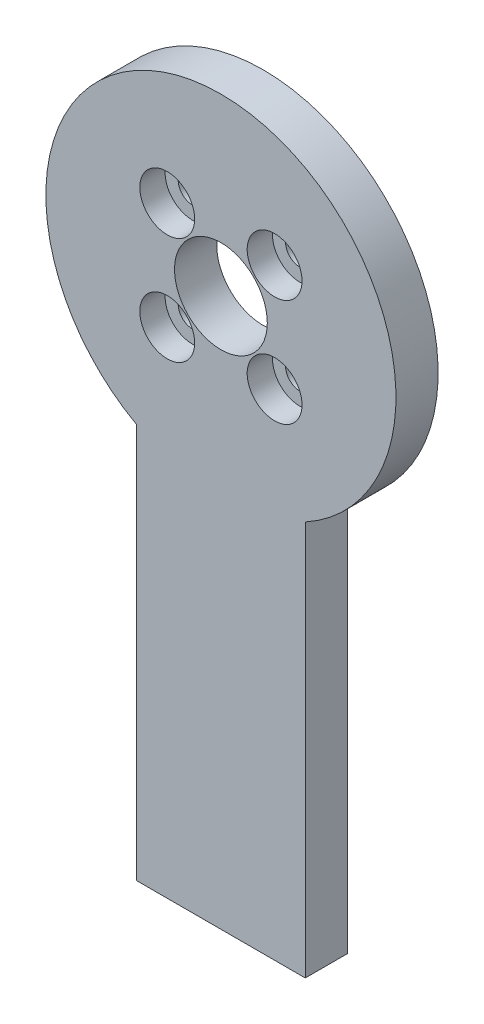
ISO-10303-21;
HEADER;
FILE_DESCRIPTION(('STEP AP214'),'2;1');
FILE_NAME('part.step','',(''),(''),'','','');
FILE_SCHEMA(('AUTOMOTIVE_DESIGN { 1 0 10303 214 1 1 1 1 }'));
ENDSEC;
DATA;
#1=APPLICATION_CONTEXT('core data for automotive mechanical design processes');
#2=APPLICATION_PROTOCOL_DEFINITION('international standard','automotive_design',2000,#1);
#3=PRODUCT_CONTEXT('',#1,'mechanical');
#4=PRODUCT('Part','Part','',(#3));
#5=PRODUCT_RELATED_PRODUCT_CATEGORY('part','',(#4));
#6=PRODUCT_DEFINITION_FORMATION('','',#4);
#7=PRODUCT_DEFINITION_CONTEXT('part definition',#1,'design');
#8=PRODUCT_DEFINITION('design','',#6,#7);
#9=PRODUCT_DEFINITION_SHAPE('','',#8);
#10=(LENGTH_UNIT() NAMED_UNIT(*) SI_UNIT(.MILLI.,.METRE.));
#11=(NAMED_UNIT(*) PLANE_ANGLE_UNIT() SI_UNIT($,.RADIAN.));
#12=(NAMED_UNIT(*) SI_UNIT($,.STERADIAN.) SOLID_ANGLE_UNIT());
#13=UNCERTAINTY_MEASURE_WITH_UNIT(LENGTH_MEASURE(1.E-05),#10,'distance_accuracy_value','');
#14=(GEOMETRIC_REPRESENTATION_CONTEXT(3) GLOBAL_UNCERTAINTY_ASSIGNED_CONTEXT((#13)) GLOBAL_UNIT_ASSIGNED_CONTEXT((#10,
#11,#12)) REPRESENTATION_CONTEXT('',''));
#15=CARTESIAN_POINT('',(0.,0.,0.));
#16=DIRECTION('',(0.,0.,1.));
#17=DIRECTION('',(1.,0.,0.));
#18=AXIS2_PLACEMENT_3D('',#15,#16,#17);
#19=CARTESIAN_POINT('',(0.,0.,5.));
#20=DIRECTION('',(0.,0.,-1.));
#21=DIRECTION('',(-1.,0.,0.));
#22=AXIS2_PLACEMENT_3D('',#19,#20,#21);
#23=CYLINDRICAL_SURFACE('',#22,20.75);
#24=CARTESIAN_POINT('',(0.,0.,5.));
#25=DIRECTION('',(0.,0.,1.));
#26=DIRECTION('',(1.,0.,0.));
#27=AXIS2_PLACEMENT_3D('',#24,#25,#26);
#28=CIRCLE('',#27,20.75);
#29=CARTESIAN_POINT('',(10.,-18.1813778355767,5.));
#30=VERTEX_POINT('',#29);
#31=CARTESIAN_POINT('',(-9.99999999999999,-18.1813778355767,5.));
#32=VERTEX_POINT('',#31);
#33=EDGE_CURVE('E11',#30,#32,#28,.T.);
#34=ORIENTED_EDGE('',*,*,#33,.F.);
#35=DIRECTION('',(0.,0.,-1.));
#36=VECTOR('',#35,1.);
#37=CARTESIAN_POINT('',(10.,-18.1813778355767,5.));
#38=LINE('',#37,#36);
#39=CARTESIAN_POINT('',(10.,-18.1813778355767,0.));
#40=VERTEX_POINT('',#39);
#41=EDGE_CURVE('E100',#30,#40,#38,.T.);
#42=ORIENTED_EDGE('',*,*,#41,.T.);
#43=CARTESIAN_POINT('',(0.,0.,0.));
#44=DIRECTION('',(0.,0.,1.));
#45=DIRECTION('',(1.,0.,0.));
#46=AXIS2_PLACEMENT_3D('',#43,#44,#45);
#47=CIRCLE('',#46,20.75);
#48=CARTESIAN_POINT('',(-9.99999999999999,-18.1813778355767,0.));
#49=VERTEX_POINT('',#48);
#50=EDGE_CURVE('E38',#40,#49,#47,.T.);
#51=ORIENTED_EDGE('',*,*,#50,.T.);
#52=DIRECTION('',(0.,0.,-1.));
#53=VECTOR('',#52,1.);
#54=CARTESIAN_POINT('',(-9.99999999999999,-18.1813778355767,5.));
#55=LINE('',#54,#53);
#56=EDGE_CURVE('E52',#49,#32,#55,.F.);
#57=ORIENTED_EDGE('',*,*,#56,.T.);
#58=EDGE_LOOP('',(#34,#42,#51,#57));
#59=FACE_BOUND('',#58,.T.);
#60=ADVANCED_FACE('F35',(#59),#23,.T.);
#61=CARTESIAN_POINT('',(0.,0.,5.));
#62=DIRECTION('',(0.,0.,1.));
#63=DIRECTION('',(1.,0.,0.));
#64=AXIS2_PLACEMENT_3D('',#61,#62,#63);
#65=PLANE('',#64);
#66=ORIENTED_EDGE('',*,*,#33,.T.);
#67=DIRECTION('',(0.,-1.,0.));
#68=VECTOR('',#67,1.);
#69=CARTESIAN_POINT('',(-9.99999999999999,-15.,5.));
#70=LINE('',#69,#68);
#71=CARTESIAN_POINT('',(-9.99999999999999,-65.,5.));
#72=VERTEX_POINT('',#71);
#73=EDGE_CURVE('E72',#32,#72,#70,.T.);
#74=ORIENTED_EDGE('',*,*,#73,.T.);
#75=DIRECTION('',(1.,0.,0.));
#76=VECTOR('',#75,1.);
#77=CARTESIAN_POINT('',(-9.99999999999999,-65.,5.));
#78=LINE('',#77,#76);
#79=CARTESIAN_POINT('',(10.,-65.,5.));
#80=VERTEX_POINT('',#79);
#81=EDGE_CURVE('E78',#72,#80,#78,.T.);
#82=ORIENTED_EDGE('',*,*,#81,.T.);
#83=DIRECTION('',(0.,1.,0.));
#84=VECTOR('',#83,1.);
#85=CARTESIAN_POINT('',(10.,-15.,5.));
#86=LINE('',#85,#84);
#87=EDGE_CURVE('E80',#80,#30,#86,.T.);
#88=ORIENTED_EDGE('',*,*,#87,.T.);
#89=EDGE_LOOP('',(#66,#74,#82,#88));
#90=FACE_BOUND('',#89,.T.);
#91=CARTESIAN_POINT('',(0.,0.,5.));
#92=DIRECTION('',(0.,0.,1.));
#93=DIRECTION('',(1.,0.,0.));
#94=AXIS2_PLACEMENT_3D('',#91,#92,#93);
#95=CIRCLE('',#94,5.5);
#96=CARTESIAN_POINT('',(5.5,0.,5.));
#97=VERTEX_POINT('',#96);
#98=EDGE_CURVE('E103',#97,#97,#95,.T.);
#99=ORIENTED_EDGE('',*,*,#98,.F.);
#100=EDGE_LOOP('',(#99));
#101=FACE_BOUND('',#100,.T.);
#102=CARTESIAN_POINT('',(-6.36396103067894,6.36396103067891,5.));
#103=DIRECTION('',(0.,0.,1.));
#104=DIRECTION('',(1.,0.,0.));
#105=AXIS2_PLACEMENT_3D('',#102,#103,#104);
#106=CIRCLE('',#105,3.25);
#107=CARTESIAN_POINT('',(-3.11396103067894,6.36396103067891,5.));
#108=VERTEX_POINT('',#107);
#109=EDGE_CURVE('E107',#108,#108,#106,.T.);
#110=ORIENTED_EDGE('',*,*,#109,.F.);
#111=EDGE_LOOP('',(#110));
#112=FACE_BOUND('',#111,.T.);
#113=CARTESIAN_POINT('',(6.36396103067891,6.36396103067895,5.));
#114=DIRECTION('',(0.,0.,1.));
#115=DIRECTION('',(1.,0.,0.));
#116=AXIS2_PLACEMENT_3D('',#113,#114,#115);
#117=CIRCLE('',#116,3.25);
#118=CARTESIAN_POINT('',(9.61396103067891,6.36396103067895,5.));
#119=VERTEX_POINT('',#118);
#120=EDGE_CURVE('E121',#119,#119,#117,.T.);
#121=ORIENTED_EDGE('',*,*,#120,.F.);
#122=EDGE_LOOP('',(#121));
#123=FACE_BOUND('',#122,.T.);
#124=CARTESIAN_POINT('',(6.36396103067894,-6.36396103067892,5.));
#125=DIRECTION('',(0.,0.,1.));
#126=DIRECTION('',(1.,0.,0.));
#127=AXIS2_PLACEMENT_3D('',#124,#125,#126);
#128=CIRCLE('',#127,3.25);
#129=CARTESIAN_POINT('',(9.61396103067894,-6.36396103067892,5.));
#130=VERTEX_POINT('',#129);
#131=EDGE_CURVE('E133',#130,#130,#128,.T.);
#132=ORIENTED_EDGE('',*,*,#131,.F.);
#133=EDGE_LOOP('',(#132));
#134=FACE_BOUND('',#133,.T.);
#135=CARTESIAN_POINT('',(-6.36396103067892,-6.36396103067894,5.));
#136=DIRECTION('',(0.,0.,1.));
#137=DIRECTION('',(1.,0.,0.));
#138=AXIS2_PLACEMENT_3D('',#135,#136,#137);
#139=CIRCLE('',#138,3.25);
#140=CARTESIAN_POINT('',(-3.11396103067892,-6.36396103067894,5.));
#141=VERTEX_POINT('',#140);
#142=EDGE_CURVE('E145',#141,#141,#139,.T.);
#143=ORIENTED_EDGE('',*,*,#142,.F.);
#144=EDGE_LOOP('',(#143));
#145=FACE_BOUND('',#144,.T.);
#146=ADVANCED_FACE('F74',(#90,#101,#112,#123,#134,#145),#65,.T.);
#147=CARTESIAN_POINT('',(0.,0.,0.));
#148=DIRECTION('',(0.,0.,1.));
#149=DIRECTION('',(1.,0.,0.));
#150=AXIS2_PLACEMENT_3D('',#147,#148,#149);
#151=PLANE('',#150);
#152=ORIENTED_EDGE('',*,*,#50,.F.);
#153=DIRECTION('',(0.,-1.,0.));
#154=VECTOR('',#153,1.);
#155=CARTESIAN_POINT('',(10.,-15.,0.));
#156=LINE('',#155,#154);
#157=CARTESIAN_POINT('',(10.,-65.,0.));
#158=VERTEX_POINT('',#157);
#159=EDGE_CURVE('E101',#40,#158,#156,.T.);
#160=ORIENTED_EDGE('',*,*,#159,.T.);
#161=DIRECTION('',(-1.,0.,0.));
#162=VECTOR('',#161,1.);
#163=CARTESIAN_POINT('',(-9.99999999999999,-65.,0.));
#164=LINE('',#163,#162);
#165=CARTESIAN_POINT('',(-9.99999999999999,-65.,0.));
#166=VERTEX_POINT('',#165);
#167=EDGE_CURVE('E162',#158,#166,#164,.T.);
#168=ORIENTED_EDGE('',*,*,#167,.T.);
#169=DIRECTION('',(0.,1.,0.));
#170=VECTOR('',#169,1.);
#171=CARTESIAN_POINT('',(-9.99999999999999,-15.,0.));
#172=LINE('',#171,#170);
#173=EDGE_CURVE('E87',#166,#49,#172,.T.);
#174=ORIENTED_EDGE('',*,*,#173,.T.);
#175=EDGE_LOOP('',(#152,#160,#168,#174));
#176=FACE_BOUND('',#175,.T.);
#177=CARTESIAN_POINT('',(0.,0.,0.));
#178=DIRECTION('',(0.,0.,1.));
#179=DIRECTION('',(1.,0.,0.));
#180=AXIS2_PLACEMENT_3D('',#177,#178,#179);
#181=CIRCLE('',#180,5.5);
#182=CARTESIAN_POINT('',(5.5,0.,0.));
#183=VERTEX_POINT('',#182);
#184=EDGE_CURVE('E104',#183,#183,#181,.T.);
#185=ORIENTED_EDGE('',*,*,#184,.T.);
#186=EDGE_LOOP('',(#185));
#187=FACE_BOUND('',#186,.T.);
#188=CARTESIAN_POINT('',(-6.36396103067894,6.36396103067891,0.));
#189=DIRECTION('',(0.,0.,1.));
#190=DIRECTION('',(1.,0.,0.));
#191=AXIS2_PLACEMENT_3D('',#188,#189,#190);
#192=CIRCLE('',#191,1.7);
#193=CARTESIAN_POINT('',(-4.66396103067894,6.36396103067891,0.));
#194=VERTEX_POINT('',#193);
#195=EDGE_CURVE('E118',#194,#194,#192,.T.);
#196=ORIENTED_EDGE('',*,*,#195,.T.);
#197=EDGE_LOOP('',(#196));
#198=FACE_BOUND('',#197,.T.);
#199=CARTESIAN_POINT('',(6.36396103067891,6.36396103067895,0.));
#200=DIRECTION('',(0.,0.,1.));
#201=DIRECTION('',(1.,0.,0.));
#202=AXIS2_PLACEMENT_3D('',#199,#200,#201);
#203=CIRCLE('',#202,1.7);
#204=CARTESIAN_POINT('',(8.06396103067891,6.36396103067895,0.));
#205=VERTEX_POINT('',#204);
#206=EDGE_CURVE('E130',#205,#205,#203,.T.);
#207=ORIENTED_EDGE('',*,*,#206,.T.);
#208=EDGE_LOOP('',(#207));
#209=FACE_BOUND('',#208,.T.);
#210=CARTESIAN_POINT('',(6.36396103067894,-6.36396103067892,0.));
#211=DIRECTION('',(0.,0.,1.));
#212=DIRECTION('',(1.,0.,0.));
#213=AXIS2_PLACEMENT_3D('',#210,#211,#212);
#214=CIRCLE('',#213,1.7);
#215=CARTESIAN_POINT('',(8.06396103067894,-6.36396103067892,0.));
#216=VERTEX_POINT('',#215);
#217=EDGE_CURVE('E142',#216,#216,#214,.T.);
#218=ORIENTED_EDGE('',*,*,#217,.T.);
#219=EDGE_LOOP('',(#218));
#220=FACE_BOUND('',#219,.T.);
#221=CARTESIAN_POINT('',(-6.36396103067892,-6.36396103067894,0.));
#222=DIRECTION('',(0.,0.,1.));
#223=DIRECTION('',(1.,0.,0.));
#224=AXIS2_PLACEMENT_3D('',#221,#222,#223);
#225=CIRCLE('',#224,1.7);
#226=CARTESIAN_POINT('',(-4.66396103067892,-6.36396103067894,0.));
#227=VERTEX_POINT('',#226);
#228=EDGE_CURVE('E154',#227,#227,#225,.T.);
#229=ORIENTED_EDGE('',*,*,#228,.T.);
#230=EDGE_LOOP('',(#229));
#231=FACE_BOUND('',#230,.T.);
#232=ADVANCED_FACE('F160',(#176,#187,#198,#209,#220,#231),#151,.F.);
#233=CARTESIAN_POINT('',(-6.36396103067892,-6.36396103067894,5.));
#234=DIRECTION('',(0.,0.,1.));
#235=DIRECTION('',(1.,0.,0.));
#236=AXIS2_PLACEMENT_3D('',#233,#234,#235);
#237=CYLINDRICAL_SURFACE('',#236,1.7);
#238=ORIENTED_EDGE('',*,*,#228,.F.);
#239=EDGE_LOOP('',(#238));
#240=FACE_BOUND('',#239,.T.);
#241=CARTESIAN_POINT('',(-6.36396103067892,-6.36396103067894,2.));
#242=DIRECTION('',(0.,0.,1.));
#243=DIRECTION('',(1.,0.,0.));
#244=AXIS2_PLACEMENT_3D('',#241,#242,#243);
#245=CIRCLE('',#244,1.7);
#246=CARTESIAN_POINT('',(-4.66396103067892,-6.36396103067894,2.));
#247=VERTEX_POINT('',#246);
#248=EDGE_CURVE('E151',#247,#247,#245,.T.);
#249=ORIENTED_EDGE('',*,*,#248,.T.);
#250=EDGE_LOOP('',(#249));
#251=FACE_BOUND('',#250,.T.);
#252=ADVANCED_FACE('F187',(#240,#251),#237,.F.);
#253=CARTESIAN_POINT('',(-4.66396103067892,-6.36396103067894,2.));
#254=DIRECTION('',(0.,0.,-1.));
#255=DIRECTION('',(-1.,0.,0.));
#256=AXIS2_PLACEMENT_3D('',#253,#254,#255);
#257=PLANE('',#256);
#258=ORIENTED_EDGE('',*,*,#248,.F.);
#259=EDGE_LOOP('',(#258));
#260=FACE_BOUND('',#259,.T.);
#261=CARTESIAN_POINT('',(-6.36396103067892,-6.36396103067894,2.));
#262=DIRECTION('',(0.,0.,1.));
#263=DIRECTION('',(1.,0.,0.));
#264=AXIS2_PLACEMENT_3D('',#261,#262,#263);
#265=CIRCLE('',#264,3.25);
#266=CARTESIAN_POINT('',(-3.11396103067892,-6.36396103067894,2.));
#267=VERTEX_POINT('',#266);
#268=EDGE_CURVE('E148',#267,#267,#265,.T.);
#269=ORIENTED_EDGE('',*,*,#268,.T.);
#270=EDGE_LOOP('',(#269));
#271=FACE_BOUND('',#270,.T.);
#272=ADVANCED_FACE('F191',(#260,#271),#257,.F.);
#273=CARTESIAN_POINT('',(-6.36396103067892,-6.36396103067894,5.));
#274=DIRECTION('',(0.,0.,1.));
#275=DIRECTION('',(1.,0.,0.));
#276=AXIS2_PLACEMENT_3D('',#273,#274,#275);
#277=CYLINDRICAL_SURFACE('',#276,3.25);
#278=ORIENTED_EDGE('',*,*,#268,.F.);
#279=EDGE_LOOP('',(#278));
#280=FACE_BOUND('',#279,.T.);
#281=ORIENTED_EDGE('',*,*,#142,.T.);
#282=EDGE_LOOP('',(#281));
#283=FACE_BOUND('',#282,.T.);
#284=ADVANCED_FACE('F195',(#280,#283),#277,.F.);
#285=CARTESIAN_POINT('',(6.36396103067894,-6.36396103067892,5.));
#286=DIRECTION('',(0.,0.,1.));
#287=DIRECTION('',(1.,0.,0.));
#288=AXIS2_PLACEMENT_3D('',#285,#286,#287);
#289=CYLINDRICAL_SURFACE('',#288,1.7);
#290=ORIENTED_EDGE('',*,*,#217,.F.);
#291=EDGE_LOOP('',(#290));
#292=FACE_BOUND('',#291,.T.);
#293=CARTESIAN_POINT('',(6.36396103067894,-6.36396103067892,2.));
#294=DIRECTION('',(0.,0.,1.));
#295=DIRECTION('',(1.,0.,0.));
#296=AXIS2_PLACEMENT_3D('',#293,#294,#295);
#297=CIRCLE('',#296,1.7);
#298=CARTESIAN_POINT('',(8.06396103067894,-6.36396103067892,2.));
#299=VERTEX_POINT('',#298);
#300=EDGE_CURVE('E139',#299,#299,#297,.T.);
#301=ORIENTED_EDGE('',*,*,#300,.T.);
#302=EDGE_LOOP('',(#301));
#303=FACE_BOUND('',#302,.T.);
#304=ADVANCED_FACE('F199',(#292,#303),#289,.F.);
#305=CARTESIAN_POINT('',(8.06396103067894,-6.36396103067892,2.));
#306=DIRECTION('',(0.,0.,-1.));
#307=DIRECTION('',(-1.,0.,0.));
#308=AXIS2_PLACEMENT_3D('',#305,#306,#307);
#309=PLANE('',#308);
#310=ORIENTED_EDGE('',*,*,#300,.F.);
#311=EDGE_LOOP('',(#310));
#312=FACE_BOUND('',#311,.T.);
#313=CARTESIAN_POINT('',(6.36396103067894,-6.36396103067892,2.));
#314=DIRECTION('',(0.,0.,1.));
#315=DIRECTION('',(1.,0.,0.));
#316=AXIS2_PLACEMENT_3D('',#313,#314,#315);
#317=CIRCLE('',#316,3.25);
#318=CARTESIAN_POINT('',(9.61396103067894,-6.36396103067892,2.));
#319=VERTEX_POINT('',#318);
#320=EDGE_CURVE('E136',#319,#319,#317,.T.);
#321=ORIENTED_EDGE('',*,*,#320,.T.);
#322=EDGE_LOOP('',(#321));
#323=FACE_BOUND('',#322,.T.);
#324=ADVANCED_FACE('F203',(#312,#323),#309,.F.);
#325=CARTESIAN_POINT('',(6.36396103067894,-6.36396103067892,5.));
#326=DIRECTION('',(0.,0.,1.));
#327=DIRECTION('',(1.,0.,0.));
#328=AXIS2_PLACEMENT_3D('',#325,#326,#327);
#329=CYLINDRICAL_SURFACE('',#328,3.25);
#330=ORIENTED_EDGE('',*,*,#320,.F.);
#331=EDGE_LOOP('',(#330));
#332=FACE_BOUND('',#331,.T.);
#333=ORIENTED_EDGE('',*,*,#131,.T.);
#334=EDGE_LOOP('',(#333));
#335=FACE_BOUND('',#334,.T.);
#336=ADVANCED_FACE('F207',(#332,#335),#329,.F.);
#337=CARTESIAN_POINT('',(6.36396103067891,6.36396103067895,5.));
#338=DIRECTION('',(0.,0.,1.));
#339=DIRECTION('',(1.,0.,0.));
#340=AXIS2_PLACEMENT_3D('',#337,#338,#339);
#341=CYLINDRICAL_SURFACE('',#340,1.7);
#342=ORIENTED_EDGE('',*,*,#206,.F.);
#343=EDGE_LOOP('',(#342));
#344=FACE_BOUND('',#343,.T.);
#345=CARTESIAN_POINT('',(6.36396103067891,6.36396103067895,2.));
#346=DIRECTION('',(0.,0.,1.));
#347=DIRECTION('',(1.,0.,0.));
#348=AXIS2_PLACEMENT_3D('',#345,#346,#347);
#349=CIRCLE('',#348,1.7);
#350=CARTESIAN_POINT('',(8.06396103067891,6.36396103067895,2.));
#351=VERTEX_POINT('',#350);
#352=EDGE_CURVE('E127',#351,#351,#349,.T.);
#353=ORIENTED_EDGE('',*,*,#352,.T.);
#354=EDGE_LOOP('',(#353));
#355=FACE_BOUND('',#354,.T.);
#356=ADVANCED_FACE('F211',(#344,#355),#341,.F.);
#357=CARTESIAN_POINT('',(8.06396103067891,6.36396103067895,2.));
#358=DIRECTION('',(0.,0.,-1.));
#359=DIRECTION('',(-1.,0.,0.));
#360=AXIS2_PLACEMENT_3D('',#357,#358,#359);
#361=PLANE('',#360);
#362=ORIENTED_EDGE('',*,*,#352,.F.);
#363=EDGE_LOOP('',(#362));
#364=FACE_BOUND('',#363,.T.);
#365=CARTESIAN_POINT('',(6.36396103067891,6.36396103067895,2.));
#366=DIRECTION('',(0.,0.,1.));
#367=DIRECTION('',(1.,0.,0.));
#368=AXIS2_PLACEMENT_3D('',#365,#366,#367);
#369=CIRCLE('',#368,3.25);
#370=CARTESIAN_POINT('',(9.61396103067891,6.36396103067895,2.));
#371=VERTEX_POINT('',#370);
#372=EDGE_CURVE('E124',#371,#371,#369,.T.);
#373=ORIENTED_EDGE('',*,*,#372,.T.);
#374=EDGE_LOOP('',(#373));
#375=FACE_BOUND('',#374,.T.);
#376=ADVANCED_FACE('F215',(#364,#375),#361,.F.);
#377=CARTESIAN_POINT('',(6.36396103067891,6.36396103067895,5.));
#378=DIRECTION('',(0.,0.,1.));
#379=DIRECTION('',(1.,0.,0.));
#380=AXIS2_PLACEMENT_3D('',#377,#378,#379);
#381=CYLINDRICAL_SURFACE('',#380,3.25);
#382=ORIENTED_EDGE('',*,*,#372,.F.);
#383=EDGE_LOOP('',(#382));
#384=FACE_BOUND('',#383,.T.);
#385=ORIENTED_EDGE('',*,*,#120,.T.);
#386=EDGE_LOOP('',(#385));
#387=FACE_BOUND('',#386,.T.);
#388=ADVANCED_FACE('F219',(#384,#387),#381,.F.);
#389=CARTESIAN_POINT('',(-6.36396103067894,6.36396103067891,5.));
#390=DIRECTION('',(0.,0.,1.));
#391=DIRECTION('',(1.,0.,0.));
#392=AXIS2_PLACEMENT_3D('',#389,#390,#391);
#393=CYLINDRICAL_SURFACE('',#392,1.7);
#394=ORIENTED_EDGE('',*,*,#195,.F.);
#395=EDGE_LOOP('',(#394));
#396=FACE_BOUND('',#395,.T.);
#397=CARTESIAN_POINT('',(-6.36396103067894,6.36396103067891,2.));
#398=DIRECTION('',(0.,0.,1.));
#399=DIRECTION('',(1.,0.,0.));
#400=AXIS2_PLACEMENT_3D('',#397,#398,#399);
#401=CIRCLE('',#400,1.7);
#402=CARTESIAN_POINT('',(-4.66396103067894,6.36396103067891,2.));
#403=VERTEX_POINT('',#402);
#404=EDGE_CURVE('E115',#403,#403,#401,.T.);
#405=ORIENTED_EDGE('',*,*,#404,.T.);
#406=EDGE_LOOP('',(#405));
#407=FACE_BOUND('',#406,.T.);
#408=ADVANCED_FACE('F223',(#396,#407),#393,.F.);
#409=CARTESIAN_POINT('',(-4.66396103067894,6.36396103067891,2.));
#410=DIRECTION('',(0.,0.,-1.));
#411=DIRECTION('',(-1.,0.,0.));
#412=AXIS2_PLACEMENT_3D('',#409,#410,#411);
#413=PLANE('',#412);
#414=ORIENTED_EDGE('',*,*,#404,.F.);
#415=EDGE_LOOP('',(#414));
#416=FACE_BOUND('',#415,.T.);
#417=CARTESIAN_POINT('',(-6.36396103067894,6.36396103067891,2.));
#418=DIRECTION('',(0.,0.,1.));
#419=DIRECTION('',(1.,0.,0.));
#420=AXIS2_PLACEMENT_3D('',#417,#418,#419);
#421=CIRCLE('',#420,3.25);
#422=CARTESIAN_POINT('',(-3.11396103067894,6.36396103067891,2.));
#423=VERTEX_POINT('',#422);
#424=EDGE_CURVE('E112',#423,#423,#421,.T.);
#425=ORIENTED_EDGE('',*,*,#424,.T.);
#426=EDGE_LOOP('',(#425));
#427=FACE_BOUND('',#426,.T.);
#428=ADVANCED_FACE('F227',(#416,#427),#413,.F.);
#429=CARTESIAN_POINT('',(-6.36396103067894,6.36396103067891,5.));
#430=DIRECTION('',(0.,0.,1.));
#431=DIRECTION('',(1.,0.,0.));
#432=AXIS2_PLACEMENT_3D('',#429,#430,#431);
#433=CYLINDRICAL_SURFACE('',#432,3.25);
#434=ORIENTED_EDGE('',*,*,#424,.F.);
#435=EDGE_LOOP('',(#434));
#436=FACE_BOUND('',#435,.T.);
#437=ORIENTED_EDGE('',*,*,#109,.T.);
#438=EDGE_LOOP('',(#437));
#439=FACE_BOUND('',#438,.T.);
#440=ADVANCED_FACE('F176',(#436,#439),#433,.F.);
#441=CARTESIAN_POINT('',(0.,0.,0.));
#442=DIRECTION('',(0.,0.,1.));
#443=DIRECTION('',(1.,0.,0.));
#444=AXIS2_PLACEMENT_3D('',#441,#442,#443);
#445=CYLINDRICAL_SURFACE('',#444,5.5);
#446=ORIENTED_EDGE('',*,*,#184,.F.);
#447=EDGE_LOOP('',(#446));
#448=FACE_BOUND('',#447,.T.);
#449=ORIENTED_EDGE('',*,*,#98,.T.);
#450=EDGE_LOOP('',(#449));
#451=FACE_BOUND('',#450,.T.);
#452=ADVANCED_FACE('F169',(#448,#451),#445,.F.);
#453=CARTESIAN_POINT('',(10.,-15.,-53.8516480713451));
#454=DIRECTION('',(1.,0.,0.));
#455=DIRECTION('',(0.,0.,-1.));
#456=AXIS2_PLACEMENT_3D('',#453,#454,#455);
#457=PLANE('',#456);
#458=ORIENTED_EDGE('',*,*,#41,.F.);
#459=ORIENTED_EDGE('',*,*,#87,.F.);
#460=DIRECTION('',(0.,0.,1.));
#461=VECTOR('',#460,1.);
#462=CARTESIAN_POINT('',(10.,-65.,-53.8516480713451));
#463=LINE('',#462,#461);
#464=EDGE_CURVE('E90',#158,#80,#463,.T.);
#465=ORIENTED_EDGE('',*,*,#464,.F.);
#466=ORIENTED_EDGE('',*,*,#159,.F.);
#467=EDGE_LOOP('',(#458,#459,#465,#466));
#468=FACE_BOUND('',#467,.T.);
#469=ADVANCED_FACE('F167',(#468),#457,.T.);
#470=CARTESIAN_POINT('',(-9.99999999999999,-15.,-53.8516480713451));
#471=DIRECTION('',(-1.,0.,0.));
#472=DIRECTION('',(0.,0.,1.));
#473=AXIS2_PLACEMENT_3D('',#470,#471,#472);
#474=PLANE('',#473);
#475=ORIENTED_EDGE('',*,*,#56,.F.);
#476=ORIENTED_EDGE('',*,*,#173,.F.);
#477=DIRECTION('',(0.,0.,1.));
#478=VECTOR('',#477,1.);
#479=CARTESIAN_POINT('',(-9.99999999999999,-65.,-53.8516480713451));
#480=LINE('',#479,#478);
#481=EDGE_CURVE('E84',#166,#72,#480,.T.);
#482=ORIENTED_EDGE('',*,*,#481,.T.);
#483=ORIENTED_EDGE('',*,*,#73,.F.);
#484=EDGE_LOOP('',(#475,#476,#482,#483));
#485=FACE_BOUND('',#484,.T.);
#486=ADVANCED_FACE('F85',(#485),#474,.T.);
#487=CARTESIAN_POINT('',(-9.99999999999999,-65.,-53.8516480713451));
#488=DIRECTION('',(0.,-1.,0.));
#489=DIRECTION('',(0.,0.,-1.));
#490=AXIS2_PLACEMENT_3D('',#487,#488,#489);
#491=PLANE('',#490);
#492=ORIENTED_EDGE('',*,*,#167,.F.);
#493=ORIENTED_EDGE('',*,*,#464,.T.);
#494=ORIENTED_EDGE('',*,*,#81,.F.);
#495=ORIENTED_EDGE('',*,*,#481,.F.);
#496=EDGE_LOOP('',(#492,#493,#494,#495));
#497=FACE_BOUND('',#496,.T.);
#498=ADVANCED_FACE('F92',(#497),#491,.T.);
#499=CLOSED_SHELL('',(#60,#146,#232,#252,#272,#284,#304,#324,#336,#356,#376,#388,#408,#428,#440,
#452,#469,#486,#498));
#500=MANIFOLD_SOLID_BREP('B2',#499);
#501=ADVANCED_BREP_SHAPE_REPRESENTATION('',(#18,#500),#14);
#502=SHAPE_DEFINITION_REPRESENTATION(#9,#501);
ENDSEC;
END-ISO-10303-21;
